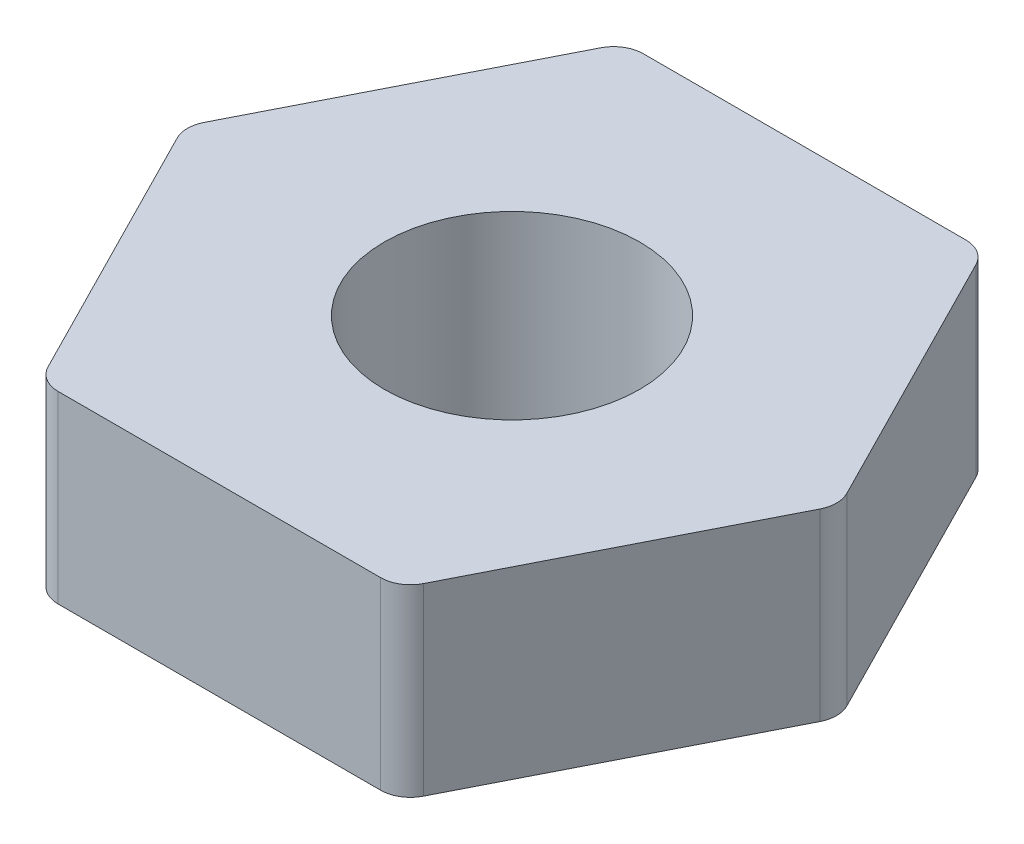
ISO-10303-21;
HEADER;
FILE_DESCRIPTION(('STEP AP214'),'2;1');
FILE_NAME('part.step','',(''),(''),'','','');
FILE_SCHEMA(('AUTOMOTIVE_DESIGN { 1 0 10303 214 1 1 1 1 }'));
ENDSEC;
DATA;
#1=APPLICATION_CONTEXT('core data for automotive mechanical design processes');
#2=APPLICATION_PROTOCOL_DEFINITION('international standard','automotive_design',2000,#1);
#3=PRODUCT_CONTEXT('',#1,'mechanical');
#4=PRODUCT('Part','Part','',(#3));
#5=PRODUCT_RELATED_PRODUCT_CATEGORY('part','',(#4));
#6=PRODUCT_DEFINITION_FORMATION('','',#4);
#7=PRODUCT_DEFINITION_CONTEXT('part definition',#1,'design');
#8=PRODUCT_DEFINITION('design','',#6,#7);
#9=PRODUCT_DEFINITION_SHAPE('','',#8);
#10=(LENGTH_UNIT() NAMED_UNIT(*) SI_UNIT(.MILLI.,.METRE.));
#11=(NAMED_UNIT(*) PLANE_ANGLE_UNIT() SI_UNIT($,.RADIAN.));
#12=(NAMED_UNIT(*) SI_UNIT($,.STERADIAN.) SOLID_ANGLE_UNIT());
#13=UNCERTAINTY_MEASURE_WITH_UNIT(LENGTH_MEASURE(1.E-05),#10,'distance_accuracy_value','');
#14=(GEOMETRIC_REPRESENTATION_CONTEXT(3) GLOBAL_UNCERTAINTY_ASSIGNED_CONTEXT((#13)) GLOBAL_UNIT_ASSIGNED_CONTEXT((#10,
#11,#12)) REPRESENTATION_CONTEXT('',''));
#15=CARTESIAN_POINT('',(0.,0.,0.));
#16=DIRECTION('',(0.,0.,1.));
#17=DIRECTION('',(1.,0.,0.));
#18=AXIS2_PLACEMENT_3D('',#15,#16,#17);
#19=CARTESIAN_POINT('',(-2.52175583756356,0.787399999999973,0.));
#20=DIRECTION('',(0.,-1.,0.));
#21=DIRECTION('',(0.,0.,-1.));
#22=AXIS2_PLACEMENT_3D('',#19,#20,#21);
#23=CYLINDRICAL_SURFACE('',#22,0.254000000000003);
#24=CARTESIAN_POINT('',(-2.52175583756356,-0.787400000000009,0.));
#25=DIRECTION('',(0.,-1.,0.));
#26=DIRECTION('',(0.,0.,-1.));
#27=AXIS2_PLACEMENT_3D('',#24,#25,#26);
#28=CIRCLE('',#27,0.254000000000003);
#29=CARTESIAN_POINT('',(-2.7481721271562,-0.787400000000014,0.115115871221207));
#30=VERTEX_POINT('',#29);
#31=CARTESIAN_POINT('',(-2.74817212715658,-0.78740000000001,-0.115115871221514));
#32=VERTEX_POINT('',#31);
#33=EDGE_CURVE('E179',#30,#32,#28,.T.);
#34=ORIENTED_EDGE('',*,*,#33,.F.);
#35=DIRECTION('',(0.,1.,0.));
#36=VECTOR('',#35,1.);
#37=CARTESIAN_POINT('',(-2.74817212715624,0.787399999999987,0.115115871221146));
#38=LINE('',#37,#36);
#39=CARTESIAN_POINT('',(-2.74817212715623,0.787399999999966,0.115115871221213));
#40=VERTEX_POINT('',#39);
#41=EDGE_CURVE('E168',#30,#40,#38,.T.);
#42=ORIENTED_EDGE('',*,*,#41,.T.);
#43=CARTESIAN_POINT('',(-2.52175583756356,0.787399999999964,0.));
#44=DIRECTION('',(0.,-1.,0.));
#45=DIRECTION('',(0.,0.,-1.));
#46=AXIS2_PLACEMENT_3D('',#43,#44,#45);
#47=CIRCLE('',#46,0.254000000000003);
#48=CARTESIAN_POINT('',(-2.74817212715645,0.787399999999964,-0.115115871221433));
#49=VERTEX_POINT('',#48);
#50=EDGE_CURVE('E20',#40,#49,#47,.T.);
#51=ORIENTED_EDGE('',*,*,#50,.T.);
#52=DIRECTION('',(0.,1.,0.));
#53=VECTOR('',#52,1.);
#54=CARTESIAN_POINT('',(-2.74817212715656,0.787399999999999,-0.115115871221555));
#55=LINE('',#54,#53);
#56=EDGE_CURVE('E151',#49,#32,#55,.F.);
#57=ORIENTED_EDGE('',*,*,#56,.T.);
#58=EDGE_LOOP('',(#34,#42,#51,#57));
#59=FACE_BOUND('',#58,.T.);
#60=ADVANCED_FACE('F17',(#59),#23,.T.);
#61=CARTESIAN_POINT('',(-1.37886560036457,0.787399999999992,-2.24790000000015));
#62=DIRECTION('',(0.,1.,0.));
#63=DIRECTION('',(0.,0.,1.));
#64=AXIS2_PLACEMENT_3D('',#61,#62,#63);
#65=CYLINDRICAL_SURFACE('',#64,0.254000000000003);
#66=CARTESIAN_POINT('',(-1.37886560036457,-0.787400000000003,-2.24790000000014));
#67=DIRECTION('',(0.,1.,0.));
#68=DIRECTION('',(0.,0.,1.));
#69=AXIS2_PLACEMENT_3D('',#66,#67,#68);
#70=CIRCLE('',#69,0.254000000000003);
#71=CARTESIAN_POINT('',(-1.60528188995736,-0.787400000000007,-2.36301587122143));
#72=VERTEX_POINT('',#71);
#73=CARTESIAN_POINT('',(-1.3788656003646,-0.787399999999979,-2.50190000000007));
#74=VERTEX_POINT('',#73);
#75=EDGE_CURVE('E177',#72,#74,#70,.F.);
#76=ORIENTED_EDGE('',*,*,#75,.F.);
#77=DIRECTION('',(0.,1.,0.));
#78=VECTOR('',#77,1.);
#79=CARTESIAN_POINT('',(-1.60528188995738,0.787399999999999,-2.36301587122139));
#80=LINE('',#79,#78);
#81=CARTESIAN_POINT('',(-1.60528188995737,0.78739999999997,-2.36301587122143));
#82=VERTEX_POINT('',#81);
#83=EDGE_CURVE('E155',#72,#82,#80,.T.);
#84=ORIENTED_EDGE('',*,*,#83,.T.);
#85=CARTESIAN_POINT('',(-1.37886560036457,0.787399999999971,-2.24790000000015));
#86=DIRECTION('',(0.,1.,0.));
#87=DIRECTION('',(0.,0.,1.));
#88=AXIS2_PLACEMENT_3D('',#85,#86,#87);
#89=CIRCLE('',#88,0.254000000000003);
#90=CARTESIAN_POINT('',(-1.3788656003646,0.787399999999969,-2.50190000000015));
#91=VERTEX_POINT('',#90);
#92=EDGE_CURVE('E184',#82,#91,#89,.F.);
#93=ORIENTED_EDGE('',*,*,#92,.T.);
#94=DIRECTION('',(0.,1.,0.));
#95=VECTOR('',#94,1.);
#96=CARTESIAN_POINT('',(-1.37886560036463,0.787399999999999,-2.50190000000006));
#97=LINE('',#96,#95);
#98=EDGE_CURVE('E146',#74,#91,#97,.T.);
#99=ORIENTED_EDGE('',*,*,#98,.F.);
#100=EDGE_LOOP('',(#76,#84,#93,#99));
#101=FACE_BOUND('',#100,.T.);
#102=ADVANCED_FACE('F232',(#101),#65,.T.);
#103=CARTESIAN_POINT('',(1.37886560036392,0.787400000000016,-2.24790000000019));
#104=DIRECTION('',(0.,-1.,0.));
#105=DIRECTION('',(0.,0.,-1.));
#106=AXIS2_PLACEMENT_3D('',#103,#104,#105);
#107=CYLINDRICAL_SURFACE('',#106,0.254000000000003);
#108=CARTESIAN_POINT('',(1.37886560036392,-0.78739999999999,-2.24790000000018));
#109=DIRECTION('',(0.,-1.,0.));
#110=DIRECTION('',(0.,0.,-1.));
#111=AXIS2_PLACEMENT_3D('',#108,#109,#110);
#112=CIRCLE('',#111,0.254000000000003);
#113=CARTESIAN_POINT('',(1.37886560036392,-0.787399999999973,-2.50190000000007));
#114=VERTEX_POINT('',#113);
#115=CARTESIAN_POINT('',(1.60528188995663,-0.787400000000015,-2.36301587122149));
#116=VERTEX_POINT('',#115);
#117=EDGE_CURVE('E175',#114,#116,#112,.T.);
#118=ORIENTED_EDGE('',*,*,#117,.F.);
#119=DIRECTION('',(0.,1.,0.));
#120=VECTOR('',#119,1.);
#121=CARTESIAN_POINT('',(1.37886560036392,0.787399999999999,-2.50190000000006));
#122=LINE('',#121,#120);
#123=CARTESIAN_POINT('',(1.37886560036392,0.787400000000034,-2.50190000000015));
#124=VERTEX_POINT('',#123);
#125=EDGE_CURVE('E147',#124,#114,#122,.F.);
#126=ORIENTED_EDGE('',*,*,#125,.F.);
#127=CARTESIAN_POINT('',(1.37886560036392,0.787400000000036,-2.24790000000019));
#128=DIRECTION('',(0.,-1.,0.));
#129=DIRECTION('',(0.,0.,-1.));
#130=AXIS2_PLACEMENT_3D('',#127,#128,#129);
#131=CIRCLE('',#130,0.254000000000003);
#132=CARTESIAN_POINT('',(1.60528188995667,0.787399999999998,-2.36301587122153));
#133=VERTEX_POINT('',#132);
#134=EDGE_CURVE('E183',#124,#133,#131,.T.);
#135=ORIENTED_EDGE('',*,*,#134,.T.);
#136=DIRECTION('',(0.,1.,0.));
#137=VECTOR('',#136,1.);
#138=CARTESIAN_POINT('',(1.60528188995663,0.787400000000013,-2.36301587122148));
#139=LINE('',#138,#137);
#140=EDGE_CURVE('E125',#116,#133,#139,.T.);
#141=ORIENTED_EDGE('',*,*,#140,.F.);
#142=EDGE_LOOP('',(#118,#126,#135,#141));
#143=FACE_BOUND('',#142,.T.);
#144=ADVANCED_FACE('F234',(#143),#107,.T.);
#145=CARTESIAN_POINT('',(2.52175583756353,0.787400000000001,-1.6306400674182E-13));
#146=DIRECTION('',(0.,-1.,0.));
#147=DIRECTION('',(0.,0.,-1.));
#148=AXIS2_PLACEMENT_3D('',#145,#146,#147);
#149=CYLINDRICAL_SURFACE('',#148,0.254000000000003);
#150=CARTESIAN_POINT('',(2.52175583756353,-0.78740000000001,-1.4876679374563E-13));
#151=DIRECTION('',(0.,-1.,0.));
#152=DIRECTION('',(0.,0.,-1.));
#153=AXIS2_PLACEMENT_3D('',#150,#151,#152);
#154=CIRCLE('',#153,0.254000000000003);
#155=CARTESIAN_POINT('',(2.74817212715599,-0.787400000000025,-0.115115871221321));
#156=VERTEX_POINT('',#155);
#157=CARTESIAN_POINT('',(2.74817212715627,-0.787399999999994,0.115115871221251));
#158=VERTEX_POINT('',#157);
#159=EDGE_CURVE('E131',#156,#158,#154,.T.);
#160=ORIENTED_EDGE('',*,*,#159,.F.);
#161=DIRECTION('',(0.,1.,0.));
#162=VECTOR('',#161,1.);
#163=CARTESIAN_POINT('',(2.74817212715599,0.787400000000013,-0.115115871221306));
#164=LINE('',#163,#162);
#165=CARTESIAN_POINT('',(2.74817212715609,0.787399999999966,-0.115115871221391));
#166=VERTEX_POINT('',#165);
#167=EDGE_CURVE('E142',#166,#156,#164,.F.);
#168=ORIENTED_EDGE('',*,*,#167,.F.);
#169=CARTESIAN_POINT('',(2.52175583756353,0.787399999999967,-1.6306400674182E-13));
#170=DIRECTION('',(0.,-1.,0.));
#171=DIRECTION('',(0.,0.,-1.));
#172=AXIS2_PLACEMENT_3D('',#169,#170,#171);
#173=CIRCLE('',#172,0.254000000000003);
#174=CARTESIAN_POINT('',(2.74817212715626,0.787399999999952,0.115115871221239));
#175=VERTEX_POINT('',#174);
#176=EDGE_CURVE('E181',#166,#175,#173,.T.);
#177=ORIENTED_EDGE('',*,*,#176,.T.);
#178=DIRECTION('',(0.,1.,0.));
#179=VECTOR('',#178,1.);
#180=CARTESIAN_POINT('',(2.74817212715624,0.787399999999997,0.115115871221311));
#181=LINE('',#180,#179);
#182=EDGE_CURVE('E132',#158,#175,#181,.T.);
#183=ORIENTED_EDGE('',*,*,#182,.F.);
#184=EDGE_LOOP('',(#160,#168,#177,#183));
#185=FACE_BOUND('',#184,.T.);
#186=ADVANCED_FACE('F240',(#185),#149,.T.);
#187=CARTESIAN_POINT('',(-4.07873037699583,-0.787400000000066,2.50189999999993));
#188=DIRECTION('',(0.,-1.,0.));
#189=DIRECTION('',(0.,0.,-1.));
#190=AXIS2_PLACEMENT_3D('',#187,#188,#189);
#191=PLANE('',#190);
#192=DIRECTION('',(-0.453212091422592,0.,-0.891402714932123));
#193=VECTOR('',#192,1.);
#194=CARTESIAN_POINT('',(1.53466962300394,-0.787400000000039,-2.50190000000008));
#195=LINE('',#194,#193);
#196=EDGE_CURVE('E139',#156,#116,#195,.T.);
#197=ORIENTED_EDGE('',*,*,#196,.F.);
#198=ORIENTED_EDGE('',*,*,#159,.T.);
#199=DIRECTION('',(0.453212091422592,0.,-0.891402714932123));
#200=VECTOR('',#199,1.);
#201=CARTESIAN_POINT('',(2.80670000000005,-0.787399999999978,0.));
#202=LINE('',#201,#200);
#203=CARTESIAN_POINT('',(1.60528188995703,-0.787399999999983,2.3630158712212));
#204=VERTEX_POINT('',#203);
#205=EDGE_CURVE('E122',#204,#158,#202,.T.);
#206=ORIENTED_EDGE('',*,*,#205,.F.);
#207=CARTESIAN_POINT('',(1.37886560036436,-0.787399999999988,2.24789999999989));
#208=DIRECTION('',(0.,-1.,0.));
#209=DIRECTION('',(0.,0.,-1.));
#210=AXIS2_PLACEMENT_3D('',#207,#208,#209);
#211=CIRCLE('',#210,0.254000000000003);
#212=CARTESIAN_POINT('',(1.3788656003643,-0.787400000000001,2.50189999999995));
#213=VERTEX_POINT('',#212);
#214=EDGE_CURVE('E108',#213,#204,#211,.F.);
#215=ORIENTED_EDGE('',*,*,#214,.F.);
#216=DIRECTION('',(1.,0.,0.));
#217=VECTOR('',#216,1.);
#218=CARTESIAN_POINT('',(1.53466962300432,-0.787400000000016,2.50189999999995));
#219=LINE('',#218,#217);
#220=CARTESIAN_POINT('',(-1.37886560036419,-0.787400000000018,2.50189999999995));
#221=VERTEX_POINT('',#220);
#222=EDGE_CURVE('E134',#221,#213,#219,.T.);
#223=ORIENTED_EDGE('',*,*,#222,.F.);
#224=CARTESIAN_POINT('',(-1.3788656003642,-0.787400000000022,2.24790000000005));
#225=DIRECTION('',(0.,1.,0.));
#226=DIRECTION('',(0.,0.,1.));
#227=AXIS2_PLACEMENT_3D('',#224,#225,#226);
#228=CIRCLE('',#227,0.254000000000003);
#229=CARTESIAN_POINT('',(-1.60528188995688,-0.787400000000021,2.36301587122131));
#230=VERTEX_POINT('',#229);
#231=EDGE_CURVE('E169',#230,#221,#228,.T.);
#232=ORIENTED_EDGE('',*,*,#231,.F.);
#233=DIRECTION('',(-0.453212091422592,0.,-0.891402714932123));
#234=VECTOR('',#233,1.);
#235=CARTESIAN_POINT('',(-2.80670000000004,-0.787400000000021,-2.29691389582952E-13));
#236=LINE('',#235,#234);
#237=EDGE_CURVE('E152',#230,#30,#236,.T.);
#238=ORIENTED_EDGE('',*,*,#237,.T.);
#239=ORIENTED_EDGE('',*,*,#33,.T.);
#240=DIRECTION('',(0.453212091422592,0.,-0.891402714932123));
#241=VECTOR('',#240,1.);
#242=CARTESIAN_POINT('',(-1.53466962300464,-0.78740000000001,-2.50190000000006));
#243=LINE('',#242,#241);
#244=EDGE_CURVE('E148',#32,#72,#243,.T.);
#245=ORIENTED_EDGE('',*,*,#244,.T.);
#246=ORIENTED_EDGE('',*,*,#75,.T.);
#247=DIRECTION('',(1.,0.,0.));
#248=VECTOR('',#247,1.);
#249=CARTESIAN_POINT('',(-1.53466962300464,-0.787399999999954,-2.50190000000007));
#250=LINE('',#249,#248);
#251=EDGE_CURVE('E143',#114,#74,#250,.F.);
#252=ORIENTED_EDGE('',*,*,#251,.F.);
#253=ORIENTED_EDGE('',*,*,#117,.T.);
#254=EDGE_LOOP('',(#197,#198,#206,#215,#223,#232,#238,#239,#245,#246,#252,#253));
#255=FACE_BOUND('',#254,.T.);
#256=CARTESIAN_POINT('',(3.54465217283013E-13,-0.787400000000015,-1.73589376397552E-13));
#257=DIRECTION('',(0.,1.,0.));
#258=DIRECTION('',(0.,0.,1.));
#259=AXIS2_PLACEMENT_3D('',#256,#257,#258);
#260=CIRCLE('',#259,1.09220000000001);
#261=CARTESIAN_POINT('',(3.54465217283013E-13,-0.787400000000005,1.09219999999984));
#262=VERTEX_POINT('',#261);
#263=EDGE_CURVE('E165',#262,#262,#260,.T.);
#264=ORIENTED_EDGE('',*,*,#263,.T.);
#265=EDGE_LOOP('',(#264));
#266=FACE_BOUND('',#265,.T.);
#267=ADVANCED_FACE('F128',(#255,#266),#191,.T.);
#268=CARTESIAN_POINT('',(1.37886560036436,0.787399999999997,2.24789999999988));
#269=DIRECTION('',(0.,-1.,0.));
#270=DIRECTION('',(0.,0.,-1.));
#271=AXIS2_PLACEMENT_3D('',#268,#269,#270);
#272=CYLINDRICAL_SURFACE('',#271,0.254000000000003);
#273=ORIENTED_EDGE('',*,*,#214,.T.);
#274=DIRECTION('',(0.,1.,0.));
#275=VECTOR('',#274,1.);
#276=CARTESIAN_POINT('',(1.60528188995702,0.787399999999997,2.36301587122121));
#277=LINE('',#276,#275);
#278=CARTESIAN_POINT('',(1.60528188995703,0.787399999999971,2.36301587122119));
#279=VERTEX_POINT('',#278);
#280=EDGE_CURVE('E111',#279,#204,#277,.F.);
#281=ORIENTED_EDGE('',*,*,#280,.F.);
#282=CARTESIAN_POINT('',(1.37886560036436,0.787400000000023,2.24789999999988));
#283=DIRECTION('',(0.,-1.,0.));
#284=DIRECTION('',(0.,0.,-1.));
#285=AXIS2_PLACEMENT_3D('',#282,#283,#284);
#286=CIRCLE('',#285,0.254000000000003);
#287=CARTESIAN_POINT('',(1.3788656003643,0.787399999999972,2.50189999999991));
#288=VERTEX_POINT('',#287);
#289=EDGE_CURVE('E35',#279,#288,#286,.T.);
#290=ORIENTED_EDGE('',*,*,#289,.T.);
#291=DIRECTION('',(0.,-1.,0.));
#292=VECTOR('',#291,1.);
#293=CARTESIAN_POINT('',(1.37886560036424,0.787400000000006,2.50189999999997));
#294=LINE('',#293,#292);
#295=EDGE_CURVE('E113',#213,#288,#294,.F.);
#296=ORIENTED_EDGE('',*,*,#295,.F.);
#297=EDGE_LOOP('',(#273,#281,#290,#296));
#298=FACE_BOUND('',#297,.T.);
#299=ADVANCED_FACE('F110',(#298),#272,.T.);
#300=CARTESIAN_POINT('',(-1.3788656003642,0.78739999999998,2.24790000000004));
#301=DIRECTION('',(0.,1.,0.));
#302=DIRECTION('',(0.,0.,1.));
#303=AXIS2_PLACEMENT_3D('',#300,#301,#302);
#304=CYLINDRICAL_SURFACE('',#303,0.254000000000003);
#305=ORIENTED_EDGE('',*,*,#231,.T.);
#306=DIRECTION('',(0.,-1.,0.));
#307=VECTOR('',#306,1.);
#308=CARTESIAN_POINT('',(-1.37886560036418,0.787400000000006,2.50189999999997));
#309=LINE('',#308,#307);
#310=CARTESIAN_POINT('',(-1.37886560036419,0.787399999999957,2.50189999999992));
#311=VERTEX_POINT('',#310);
#312=EDGE_CURVE('E161',#311,#221,#309,.T.);
#313=ORIENTED_EDGE('',*,*,#312,.F.);
#314=CARTESIAN_POINT('',(-1.3788656003642,0.78739999999999,2.24790000000004));
#315=DIRECTION('',(0.,1.,0.));
#316=DIRECTION('',(0.,0.,1.));
#317=AXIS2_PLACEMENT_3D('',#314,#315,#316);
#318=CIRCLE('',#317,0.254000000000003);
#319=CARTESIAN_POINT('',(-1.60528188995692,0.787399999999958,2.36301587122132));
#320=VERTEX_POINT('',#319);
#321=EDGE_CURVE('E99',#311,#320,#318,.F.);
#322=ORIENTED_EDGE('',*,*,#321,.T.);
#323=DIRECTION('',(0.,1.,0.));
#324=VECTOR('',#323,1.);
#325=CARTESIAN_POINT('',(-1.60528188995691,0.787399999999987,2.36301587122128));
#326=LINE('',#325,#324);
#327=EDGE_CURVE('E156',#320,#230,#326,.F.);
#328=ORIENTED_EDGE('',*,*,#327,.T.);
#329=EDGE_LOOP('',(#305,#313,#322,#328));
#330=FACE_BOUND('',#329,.T.);
#331=ADVANCED_FACE('F217',(#330),#304,.T.);
#332=CARTESIAN_POINT('',(3.46944695195361E-13,-4.80060000000011,-1.37043154602168E-13));
#333=DIRECTION('',(0.,1.,0.));
#334=DIRECTION('',(0.,0.,1.));
#335=AXIS2_PLACEMENT_3D('',#332,#333,#334);
#336=CYLINDRICAL_SURFACE('',#335,1.09220000000001);
#337=ORIENTED_EDGE('',*,*,#263,.F.);
#338=EDGE_LOOP('',(#337));
#339=FACE_BOUND('',#338,.T.);
#340=CARTESIAN_POINT('',(3.574163082288E-13,0.787399999999975,-1.87930298874222E-13));
#341=DIRECTION('',(0.,1.,0.));
#342=DIRECTION('',(0.,0.,1.));
#343=AXIS2_PLACEMENT_3D('',#340,#341,#342);
#344=CIRCLE('',#343,1.09220000000001);
#345=CARTESIAN_POINT('',(3.574163082288E-13,0.787399999999985,1.09219999999982));
#346=VERTEX_POINT('',#345);
#347=EDGE_CURVE('E157',#346,#346,#344,.T.);
#348=ORIENTED_EDGE('',*,*,#347,.T.);
#349=EDGE_LOOP('',(#348));
#350=FACE_BOUND('',#349,.T.);
#351=ADVANCED_FACE('F262',(#339,#350),#336,.F.);
#352=CARTESIAN_POINT('',(-2.80670000000005,0.787399999999987,-2.25514051876985E-13));
#353=DIRECTION('',(0.891402714932123,0.,-0.453212091422592));
#354=DIRECTION('',(-0.453212091422592,0.,-0.891402714932123));
#355=AXIS2_PLACEMENT_3D('',#352,#353,#354);
#356=PLANE('',#355);
#357=ORIENTED_EDGE('',*,*,#327,.F.);
#358=DIRECTION('',(-0.453212091422591,0.,-0.891402714932124));
#359=VECTOR('',#358,1.);
#360=CARTESIAN_POINT('',(-1.60528188995694,0.787399999999924,2.3630158712213));
#361=LINE('',#360,#359);
#362=EDGE_CURVE('E160',#320,#40,#361,.T.);
#363=ORIENTED_EDGE('',*,*,#362,.T.);
#364=ORIENTED_EDGE('',*,*,#41,.F.);
#365=ORIENTED_EDGE('',*,*,#237,.F.);
#366=EDGE_LOOP('',(#357,#363,#364,#365));
#367=FACE_BOUND('',#366,.T.);
#368=ADVANCED_FACE('F222',(#367),#356,.F.);
#369=CARTESIAN_POINT('',(-1.53466962300464,0.787399999999999,-2.50190000000006));
#370=DIRECTION('',(0.891402714932123,0.,0.453212091422592));
#371=DIRECTION('',(0.453212091422592,0.,-0.891402714932123));
#372=AXIS2_PLACEMENT_3D('',#369,#370,#371);
#373=PLANE('',#372);
#374=ORIENTED_EDGE('',*,*,#56,.F.);
#375=DIRECTION('',(0.453212091422475,0.,-0.891402714932183));
#376=VECTOR('',#375,1.);
#377=CARTESIAN_POINT('',(-2.74817212715628,0.787399999999949,-0.115115871221413));
#378=LINE('',#377,#376);
#379=EDGE_CURVE('E198',#49,#82,#378,.T.);
#380=ORIENTED_EDGE('',*,*,#379,.T.);
#381=ORIENTED_EDGE('',*,*,#83,.F.);
#382=ORIENTED_EDGE('',*,*,#244,.F.);
#383=EDGE_LOOP('',(#374,#380,#381,#382));
#384=FACE_BOUND('',#383,.T.);
#385=ADVANCED_FACE('F197',(#384),#373,.F.);
#386=CARTESIAN_POINT('',(-1.53466962300464,0.787399999999999,-2.50190000000006));
#387=DIRECTION('',(0.,0.,-1.));
#388=DIRECTION('',(0.,1.,0.));
#389=AXIS2_PLACEMENT_3D('',#386,#387,#388);
#390=PLANE('',#389);
#391=ORIENTED_EDGE('',*,*,#251,.T.);
#392=ORIENTED_EDGE('',*,*,#98,.T.);
#393=DIRECTION('',(1.,0.,0.));
#394=VECTOR('',#393,1.);
#395=CARTESIAN_POINT('',(-4.07873037699583,0.787399999999973,-2.50190000000024));
#396=LINE('',#395,#394);
#397=EDGE_CURVE('E203',#91,#124,#396,.T.);
#398=ORIENTED_EDGE('',*,*,#397,.T.);
#399=ORIENTED_EDGE('',*,*,#125,.T.);
#400=EDGE_LOOP('',(#391,#392,#398,#399));
#401=FACE_BOUND('',#400,.T.);
#402=ADVANCED_FACE('F229',(#401),#390,.T.);
#403=CARTESIAN_POINT('',(1.53466962300393,0.787400000000013,-2.50190000000007));
#404=DIRECTION('',(0.891402714932123,0.,-0.453212091422592));
#405=DIRECTION('',(-0.453212091422592,0.,-0.891402714932123));
#406=AXIS2_PLACEMENT_3D('',#403,#404,#405);
#407=PLANE('',#406);
#408=ORIENTED_EDGE('',*,*,#196,.T.);
#409=ORIENTED_EDGE('',*,*,#140,.T.);
#410=DIRECTION('',(0.45321209142266,0.,0.891402714932088));
#411=VECTOR('',#410,1.);
#412=CARTESIAN_POINT('',(1.60528188995671,0.787399999999961,-2.36301587122149));
#413=LINE('',#412,#411);
#414=EDGE_CURVE('E206',#133,#166,#413,.T.);
#415=ORIENTED_EDGE('',*,*,#414,.T.);
#416=ORIENTED_EDGE('',*,*,#167,.T.);
#417=EDGE_LOOP('',(#408,#409,#415,#416));
#418=FACE_BOUND('',#417,.T.);
#419=ADVANCED_FACE('F252',(#418),#407,.T.);
#420=CARTESIAN_POINT('',(2.80670000000005,0.787399999999997,0.));
#421=DIRECTION('',(0.891402714932123,0.,0.453212091422592));
#422=DIRECTION('',(0.453212091422592,0.,-0.891402714932123));
#423=AXIS2_PLACEMENT_3D('',#420,#421,#422);
#424=PLANE('',#423);
#425=ORIENTED_EDGE('',*,*,#205,.T.);
#426=ORIENTED_EDGE('',*,*,#182,.T.);
#427=DIRECTION('',(-0.453212091422585,0.,0.891402714932127));
#428=VECTOR('',#427,1.);
#429=CARTESIAN_POINT('',(2.7481721271562,0.787399999999937,0.115115871221358));
#430=LINE('',#429,#428);
#431=EDGE_CURVE('E26',#175,#279,#430,.T.);
#432=ORIENTED_EDGE('',*,*,#431,.T.);
#433=ORIENTED_EDGE('',*,*,#280,.T.);
#434=EDGE_LOOP('',(#425,#426,#432,#433));
#435=FACE_BOUND('',#434,.T.);
#436=ADVANCED_FACE('F120',(#435),#424,.T.);
#437=CARTESIAN_POINT('',(1.53466962300432,0.787400000000006,2.50189999999997));
#438=DIRECTION('',(0.,0.,1.));
#439=DIRECTION('',(0.,-1.,0.));
#440=AXIS2_PLACEMENT_3D('',#437,#438,#439);
#441=PLANE('',#440);
#442=DIRECTION('',(1.,0.,0.));
#443=VECTOR('',#442,1.);
#444=CARTESIAN_POINT('',(-4.07873037699583,0.787399999999928,2.5018999999999));
#445=LINE('',#444,#443);
#446=EDGE_CURVE('E11',#288,#311,#445,.F.);
#447=ORIENTED_EDGE('',*,*,#446,.T.);
#448=ORIENTED_EDGE('',*,*,#312,.T.);
#449=ORIENTED_EDGE('',*,*,#222,.T.);
#450=ORIENTED_EDGE('',*,*,#295,.T.);
#451=EDGE_LOOP('',(#447,#448,#449,#450));
#452=FACE_BOUND('',#451,.T.);
#453=ADVANCED_FACE('F225',(#452),#441,.T.);
#454=CARTESIAN_POINT('',(-4.07873037699583,0.787399999999928,2.50189999999994));
#455=DIRECTION('',(0.,-1.,0.));
#456=DIRECTION('',(0.,0.,-1.));
#457=AXIS2_PLACEMENT_3D('',#454,#455,#456);
#458=PLANE('',#457);
#459=ORIENTED_EDGE('',*,*,#289,.F.);
#460=ORIENTED_EDGE('',*,*,#431,.F.);
#461=ORIENTED_EDGE('',*,*,#176,.F.);
#462=ORIENTED_EDGE('',*,*,#414,.F.);
#463=ORIENTED_EDGE('',*,*,#134,.F.);
#464=ORIENTED_EDGE('',*,*,#397,.F.);
#465=ORIENTED_EDGE('',*,*,#92,.F.);
#466=ORIENTED_EDGE('',*,*,#379,.F.);
#467=ORIENTED_EDGE('',*,*,#50,.F.);
#468=ORIENTED_EDGE('',*,*,#362,.F.);
#469=ORIENTED_EDGE('',*,*,#321,.F.);
#470=ORIENTED_EDGE('',*,*,#446,.F.);
#471=EDGE_LOOP('',(#459,#460,#461,#462,#463,#464,#465,#466,#467,#468,#469,#470));
#472=FACE_BOUND('',#471,.T.);
#473=ORIENTED_EDGE('',*,*,#347,.F.);
#474=EDGE_LOOP('',(#473));
#475=FACE_BOUND('',#474,.T.);
#476=ADVANCED_FACE('F200',(#472,#475),#458,.F.);
#477=CLOSED_SHELL('',(#60,#102,#144,#186,#267,#299,#331,#351,#368,#385,#402,#419,#436,#453,#476));
#478=MANIFOLD_SOLID_BREP('B1',#477);
#479=ADVANCED_BREP_SHAPE_REPRESENTATION('',(#18,#478),#14);
#480=SHAPE_DEFINITION_REPRESENTATION(#9,#479);
ENDSEC;
END-ISO-10303-21;
